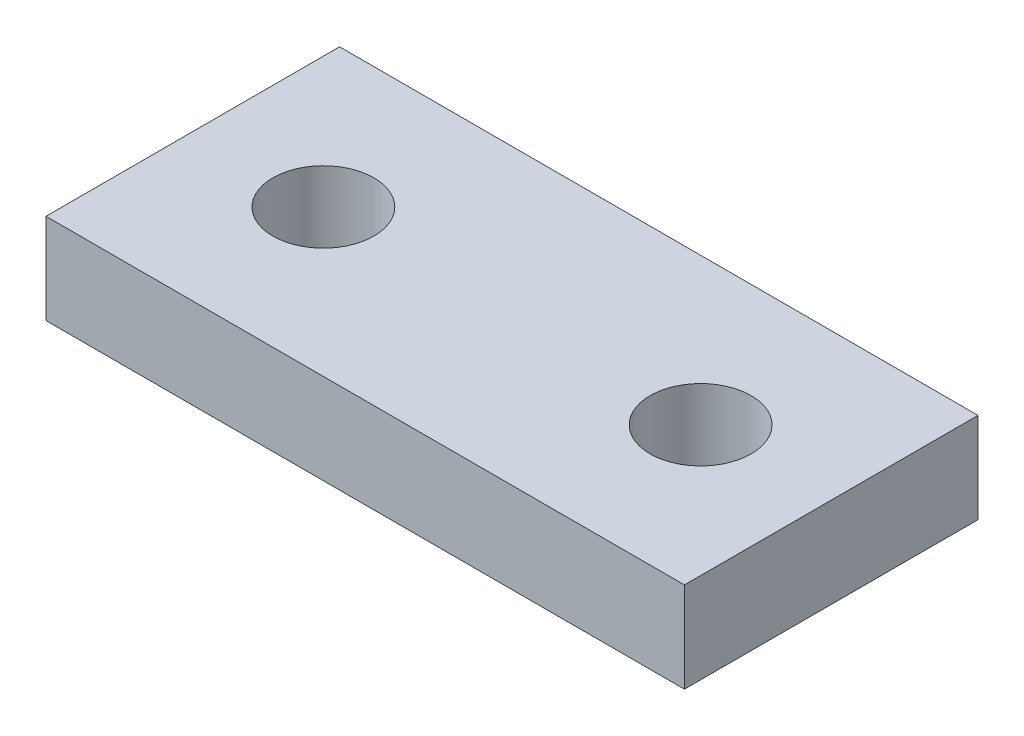
ISO-10303-21;
HEADER;
FILE_DESCRIPTION(('STEP AP214'),'2;1');
FILE_NAME('part.step','',(''),(''),'','','');
FILE_SCHEMA(('AUTOMOTIVE_DESIGN { 1 0 10303 214 1 1 1 1 }'));
ENDSEC;
DATA;
#1=APPLICATION_CONTEXT('core data for automotive mechanical design processes');
#2=APPLICATION_PROTOCOL_DEFINITION('international standard','automotive_design',2000,#1);
#3=PRODUCT_CONTEXT('',#1,'mechanical');
#4=PRODUCT('Part','Part','',(#3));
#5=PRODUCT_RELATED_PRODUCT_CATEGORY('part','',(#4));
#6=PRODUCT_DEFINITION_FORMATION('','',#4);
#7=PRODUCT_DEFINITION_CONTEXT('part definition',#1,'design');
#8=PRODUCT_DEFINITION('design','',#6,#7);
#9=PRODUCT_DEFINITION_SHAPE('','',#8);
#10=(LENGTH_UNIT() NAMED_UNIT(*) SI_UNIT(.MILLI.,.METRE.));
#11=(NAMED_UNIT(*) PLANE_ANGLE_UNIT() SI_UNIT($,.RADIAN.));
#12=(NAMED_UNIT(*) SI_UNIT($,.STERADIAN.) SOLID_ANGLE_UNIT());
#13=UNCERTAINTY_MEASURE_WITH_UNIT(LENGTH_MEASURE(1.E-05),#10,'distance_accuracy_value','');
#14=(GEOMETRIC_REPRESENTATION_CONTEXT(3) GLOBAL_UNCERTAINTY_ASSIGNED_CONTEXT((#13)) GLOBAL_UNIT_ASSIGNED_CONTEXT((#10,
#11,#12)) REPRESENTATION_CONTEXT('',''));
#15=CARTESIAN_POINT('',(0.,0.,0.));
#16=DIRECTION('',(0.,0.,1.));
#17=DIRECTION('',(1.,0.,0.));
#18=AXIS2_PLACEMENT_3D('',#15,#16,#17);
#19=CARTESIAN_POINT('',(134.650411453879,38.1,-61.9168096990138));
#20=DIRECTION('',(-1.,0.,0.));
#21=DIRECTION('',(0.,0.,1.));
#22=AXIS2_PLACEMENT_3D('',#19,#20,#21);
#23=PLANE('',#22);
#24=DIRECTION('',(0.,0.,-1.));
#25=VECTOR('',#24,1.);
#26=CARTESIAN_POINT('',(134.650411453879,0.,-61.9168096990138));
#27=LINE('',#26,#25);
#28=CARTESIAN_POINT('',(134.650411453879,0.,61.9168096990138));
#29=VERTEX_POINT('',#28);
#30=CARTESIAN_POINT('',(134.650411453879,0.,-61.9168096990138));
#31=VERTEX_POINT('',#30);
#32=EDGE_CURVE('E96',#29,#31,#27,.T.);
#33=ORIENTED_EDGE('',*,*,#32,.T.);
#34=DIRECTION('',(0.,-1.,0.));
#35=VECTOR('',#34,1.);
#36=CARTESIAN_POINT('',(134.650411453879,38.1,-61.9168096990138));
#37=LINE('',#36,#35);
#38=CARTESIAN_POINT('',(134.650411453879,38.1,-61.9168096990138));
#39=VERTEX_POINT('',#38);
#40=EDGE_CURVE('E11',#39,#31,#37,.T.);
#41=ORIENTED_EDGE('',*,*,#40,.F.);
#42=DIRECTION('',(0.,0.,-1.));
#43=VECTOR('',#42,1.);
#44=CARTESIAN_POINT('',(134.650411453879,38.1,-61.9168096990138));
#45=LINE('',#44,#43);
#46=CARTESIAN_POINT('',(134.650411453879,38.1,61.9168096990138));
#47=VERTEX_POINT('',#46);
#48=EDGE_CURVE('E84',#47,#39,#45,.T.);
#49=ORIENTED_EDGE('',*,*,#48,.F.);
#50=DIRECTION('',(0.,-1.,0.));
#51=VECTOR('',#50,1.);
#52=CARTESIAN_POINT('',(134.650411453879,38.1,61.9168096990138));
#53=LINE('',#52,#51);
#54=EDGE_CURVE('E92',#47,#29,#53,.T.);
#55=ORIENTED_EDGE('',*,*,#54,.T.);
#56=EDGE_LOOP('',(#33,#41,#49,#55));
#57=FACE_BOUND('',#56,.T.);
#58=ADVANCED_FACE('F33',(#57),#23,.F.);
#59=CARTESIAN_POINT('',(-134.650411453879,38.1,-61.9168096990138));
#60=DIRECTION('',(0.,0.,1.));
#61=DIRECTION('',(1.,0.,0.));
#62=AXIS2_PLACEMENT_3D('',#59,#60,#61);
#63=PLANE('',#62);
#64=DIRECTION('',(-1.,0.,0.));
#65=VECTOR('',#64,1.);
#66=CARTESIAN_POINT('',(-134.650411453879,0.,-61.9168096990138));
#67=LINE('',#66,#65);
#68=CARTESIAN_POINT('',(-134.650411453879,0.,-61.9168096990138));
#69=VERTEX_POINT('',#68);
#70=EDGE_CURVE('E88',#31,#69,#67,.T.);
#71=ORIENTED_EDGE('',*,*,#70,.T.);
#72=DIRECTION('',(0.,-1.,0.));
#73=VECTOR('',#72,1.);
#74=CARTESIAN_POINT('',(-134.650411453879,38.1,-61.9168096990138));
#75=LINE('',#74,#73);
#76=CARTESIAN_POINT('',(-134.650411453879,38.1,-61.9168096990138));
#77=VERTEX_POINT('',#76);
#78=EDGE_CURVE('E41',#77,#69,#75,.T.);
#79=ORIENTED_EDGE('',*,*,#78,.F.);
#80=DIRECTION('',(-1.,0.,0.));
#81=VECTOR('',#80,1.);
#82=CARTESIAN_POINT('',(-134.650411453879,38.1,-61.9168096990138));
#83=LINE('',#82,#81);
#84=EDGE_CURVE('E79',#39,#77,#83,.T.);
#85=ORIENTED_EDGE('',*,*,#84,.F.);
#86=ORIENTED_EDGE('',*,*,#40,.T.);
#87=EDGE_LOOP('',(#71,#79,#85,#86));
#88=FACE_BOUND('',#87,.T.);
#89=ADVANCED_FACE('F87',(#88),#63,.F.);
#90=CARTESIAN_POINT('',(-134.650411453879,38.1,-61.9168096990138));
#91=DIRECTION('',(1.,0.,0.));
#92=DIRECTION('',(0.,0.,-1.));
#93=AXIS2_PLACEMENT_3D('',#90,#91,#92);
#94=PLANE('',#93);
#95=DIRECTION('',(0.,0.,1.));
#96=VECTOR('',#95,1.);
#97=CARTESIAN_POINT('',(-134.650411453879,0.,-61.9168096990138));
#98=LINE('',#97,#96);
#99=CARTESIAN_POINT('',(-134.650411453879,0.,61.9168096990138));
#100=VERTEX_POINT('',#99);
#101=EDGE_CURVE('E66',#69,#100,#98,.T.);
#102=ORIENTED_EDGE('',*,*,#101,.T.);
#103=DIRECTION('',(0.,-1.,0.));
#104=VECTOR('',#103,1.);
#105=CARTESIAN_POINT('',(-134.650411453879,38.1,61.9168096990138));
#106=LINE('',#105,#104);
#107=CARTESIAN_POINT('',(-134.650411453879,38.1,61.9168096990138));
#108=VERTEX_POINT('',#107);
#109=EDGE_CURVE('E89',#108,#100,#106,.T.);
#110=ORIENTED_EDGE('',*,*,#109,.F.);
#111=DIRECTION('',(0.,0.,1.));
#112=VECTOR('',#111,1.);
#113=CARTESIAN_POINT('',(-134.650411453879,38.1,-61.9168096990138));
#114=LINE('',#113,#112);
#115=EDGE_CURVE('E82',#77,#108,#114,.T.);
#116=ORIENTED_EDGE('',*,*,#115,.F.);
#117=ORIENTED_EDGE('',*,*,#78,.T.);
#118=EDGE_LOOP('',(#102,#110,#116,#117));
#119=FACE_BOUND('',#118,.T.);
#120=ADVANCED_FACE('F90',(#119),#94,.F.);
#121=CARTESIAN_POINT('',(-134.650411453879,38.1,61.9168096990138));
#122=DIRECTION('',(0.,0.,-1.));
#123=DIRECTION('',(-1.,0.,0.));
#124=AXIS2_PLACEMENT_3D('',#121,#122,#123);
#125=PLANE('',#124);
#126=DIRECTION('',(1.,0.,0.));
#127=VECTOR('',#126,1.);
#128=CARTESIAN_POINT('',(-134.650411453879,0.,61.9168096990138));
#129=LINE('',#128,#127);
#130=EDGE_CURVE('E72',#100,#29,#129,.T.);
#131=ORIENTED_EDGE('',*,*,#130,.T.);
#132=ORIENTED_EDGE('',*,*,#54,.F.);
#133=DIRECTION('',(1.,0.,0.));
#134=VECTOR('',#133,1.);
#135=CARTESIAN_POINT('',(-134.650411453879,38.1,61.9168096990138));
#136=LINE('',#135,#134);
#137=EDGE_CURVE('E49',#108,#47,#136,.T.);
#138=ORIENTED_EDGE('',*,*,#137,.F.);
#139=ORIENTED_EDGE('',*,*,#109,.T.);
#140=EDGE_LOOP('',(#131,#132,#138,#139));
#141=FACE_BOUND('',#140,.T.);
#142=ADVANCED_FACE('F104',(#141),#125,.F.);
#143=CARTESIAN_POINT('',(0.,38.1,0.));
#144=DIRECTION('',(0.,1.,0.));
#145=DIRECTION('',(0.,0.,1.));
#146=AXIS2_PLACEMENT_3D('',#143,#144,#145);
#147=PLANE('',#146);
#148=CARTESIAN_POINT('',(79.5622500583684,38.1,0.));
#149=DIRECTION('',(0.,-1.,0.));
#150=DIRECTION('',(0.,0.,1.));
#151=AXIS2_PLACEMENT_3D('',#148,#149,#150);
#152=CIRCLE('',#151,21.3082574883515);
#153=CARTESIAN_POINT('',(79.5622500583684,38.1,21.3082574883515));
#154=VERTEX_POINT('',#153);
#155=EDGE_CURVE('E116',#154,#154,#152,.T.);
#156=ORIENTED_EDGE('',*,*,#155,.T.);
#157=EDGE_LOOP('',(#156));
#158=FACE_BOUND('',#157,.T.);
#159=CARTESIAN_POINT('',(-79.5622500583684,38.1,0.));
#160=DIRECTION('',(0.,1.,0.));
#161=DIRECTION('',(0.,0.,1.));
#162=AXIS2_PLACEMENT_3D('',#159,#160,#161);
#163=CIRCLE('',#162,21.3082574883515);
#164=CARTESIAN_POINT('',(-79.5622500583684,38.1,21.3082574883515));
#165=VERTEX_POINT('',#164);
#166=EDGE_CURVE('E110',#165,#165,#163,.T.);
#167=ORIENTED_EDGE('',*,*,#166,.F.);
#168=EDGE_LOOP('',(#167));
#169=FACE_BOUND('',#168,.T.);
#170=ORIENTED_EDGE('',*,*,#48,.T.);
#171=ORIENTED_EDGE('',*,*,#84,.T.);
#172=ORIENTED_EDGE('',*,*,#115,.T.);
#173=ORIENTED_EDGE('',*,*,#137,.T.);
#174=EDGE_LOOP('',(#170,#171,#172,#173));
#175=FACE_BOUND('',#174,.T.);
#176=ADVANCED_FACE('F80',(#158,#169,#175),#147,.T.);
#177=CARTESIAN_POINT('',(0.,0.,0.));
#178=DIRECTION('',(0.,1.,0.));
#179=DIRECTION('',(0.,0.,1.));
#180=AXIS2_PLACEMENT_3D('',#177,#178,#179);
#181=PLANE('',#180);
#182=CARTESIAN_POINT('',(79.5622500583684,0.,0.));
#183=DIRECTION('',(0.,-1.,0.));
#184=DIRECTION('',(0.,0.,1.));
#185=AXIS2_PLACEMENT_3D('',#182,#183,#184);
#186=CIRCLE('',#185,21.3082574883515);
#187=CARTESIAN_POINT('',(79.5622500583684,0.,21.3082574883515));
#188=VERTEX_POINT('',#187);
#189=EDGE_CURVE('E113',#188,#188,#186,.T.);
#190=ORIENTED_EDGE('',*,*,#189,.F.);
#191=EDGE_LOOP('',(#190));
#192=FACE_BOUND('',#191,.T.);
#193=CARTESIAN_POINT('',(-79.5622500583684,0.,0.));
#194=DIRECTION('',(0.,1.,0.));
#195=DIRECTION('',(0.,0.,1.));
#196=AXIS2_PLACEMENT_3D('',#193,#194,#195);
#197=CIRCLE('',#196,21.3082574883515);
#198=CARTESIAN_POINT('',(-79.5622500583684,0.,21.3082574883515));
#199=VERTEX_POINT('',#198);
#200=EDGE_CURVE('E99',#199,#199,#197,.T.);
#201=ORIENTED_EDGE('',*,*,#200,.T.);
#202=EDGE_LOOP('',(#201));
#203=FACE_BOUND('',#202,.T.);
#204=ORIENTED_EDGE('',*,*,#32,.F.);
#205=ORIENTED_EDGE('',*,*,#130,.F.);
#206=ORIENTED_EDGE('',*,*,#101,.F.);
#207=ORIENTED_EDGE('',*,*,#70,.F.);
#208=EDGE_LOOP('',(#204,#205,#206,#207));
#209=FACE_BOUND('',#208,.T.);
#210=ADVANCED_FACE('F107',(#192,#203,#209),#181,.F.);
#211=CARTESIAN_POINT('',(-79.5622500583684,0.,0.));
#212=DIRECTION('',(0.,1.,0.));
#213=DIRECTION('',(0.,0.,1.));
#214=AXIS2_PLACEMENT_3D('',#211,#212,#213);
#215=CYLINDRICAL_SURFACE('',#214,21.3082574883515);
#216=ORIENTED_EDGE('',*,*,#200,.F.);
#217=EDGE_LOOP('',(#216));
#218=FACE_BOUND('',#217,.T.);
#219=ORIENTED_EDGE('',*,*,#166,.T.);
#220=EDGE_LOOP('',(#219));
#221=FACE_BOUND('',#220,.T.);
#222=ADVANCED_FACE('F127',(#218,#221),#215,.F.);
#223=CARTESIAN_POINT('',(79.5622500583684,0.,0.));
#224=DIRECTION('',(0.,1.,0.));
#225=DIRECTION('',(0.,0.,1.));
#226=AXIS2_PLACEMENT_3D('',#223,#224,#225);
#227=CYLINDRICAL_SURFACE('',#226,21.3082574883515);
#228=ORIENTED_EDGE('',*,*,#189,.T.);
#229=EDGE_LOOP('',(#228));
#230=FACE_BOUND('',#229,.T.);
#231=ORIENTED_EDGE('',*,*,#155,.F.);
#232=EDGE_LOOP('',(#231));
#233=FACE_BOUND('',#232,.T.);
#234=ADVANCED_FACE('F122',(#230,#233),#227,.F.);
#235=CLOSED_SHELL('',(#58,#89,#120,#142,#176,#210,#222,#234));
#236=MANIFOLD_SOLID_BREP('B2',#235);
#237=ADVANCED_BREP_SHAPE_REPRESENTATION('',(#18,#236),#14);
#238=SHAPE_DEFINITION_REPRESENTATION(#9,#237);
ENDSEC;
END-ISO-10303-21;
